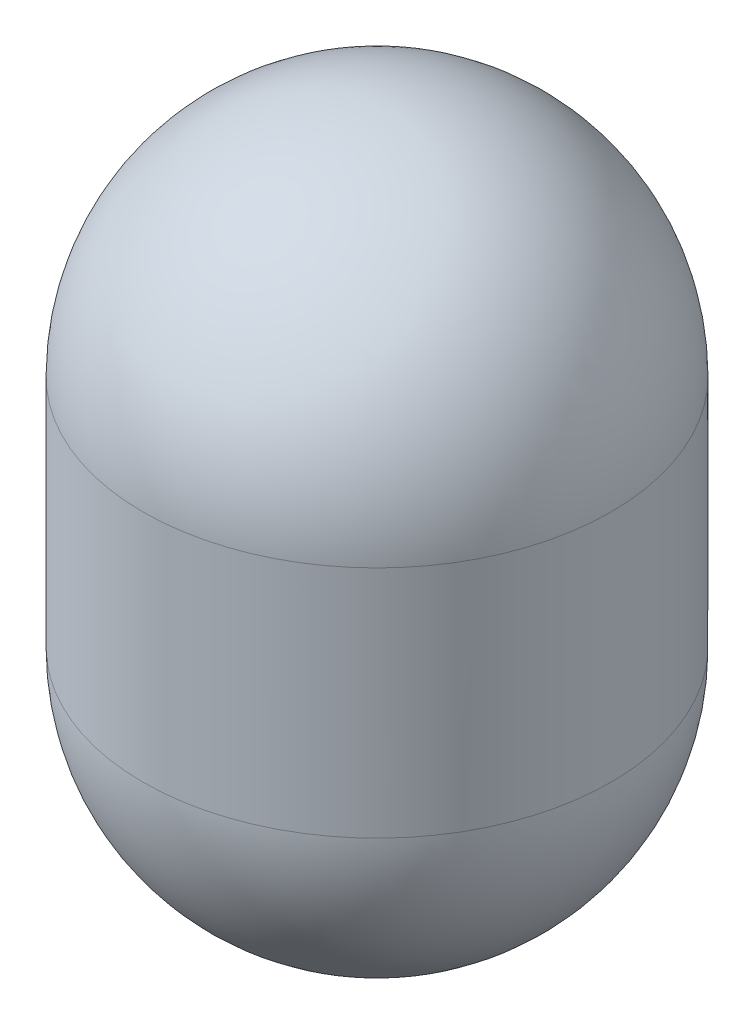
ISO-10303-21;
HEADER;
FILE_DESCRIPTION(('STEP AP214'),'2;1');
FILE_NAME('part.step','',(''),(''),'','','');
FILE_SCHEMA(('AUTOMOTIVE_DESIGN { 1 0 10303 214 1 1 1 1 }'));
ENDSEC;
DATA;
#1=APPLICATION_CONTEXT('core data for automotive mechanical design processes');
#2=APPLICATION_PROTOCOL_DEFINITION('international standard','automotive_design',2000,#1);
#3=PRODUCT_CONTEXT('',#1,'mechanical');
#4=PRODUCT('Part','Part','',(#3));
#5=PRODUCT_RELATED_PRODUCT_CATEGORY('part','',(#4));
#6=PRODUCT_DEFINITION_FORMATION('','',#4);
#7=PRODUCT_DEFINITION_CONTEXT('part definition',#1,'design');
#8=PRODUCT_DEFINITION('design','',#6,#7);
#9=PRODUCT_DEFINITION_SHAPE('','',#8);
#10=(LENGTH_UNIT() NAMED_UNIT(*) SI_UNIT(.MILLI.,.METRE.));
#11=(NAMED_UNIT(*) PLANE_ANGLE_UNIT() SI_UNIT($,.RADIAN.));
#12=(NAMED_UNIT(*) SI_UNIT($,.STERADIAN.) SOLID_ANGLE_UNIT());
#13=UNCERTAINTY_MEASURE_WITH_UNIT(LENGTH_MEASURE(1.E-05),#10,'distance_accuracy_value','');
#14=(GEOMETRIC_REPRESENTATION_CONTEXT(3) GLOBAL_UNCERTAINTY_ASSIGNED_CONTEXT((#13)) GLOBAL_UNIT_ASSIGNED_CONTEXT((#10,
#11,#12)) REPRESENTATION_CONTEXT('',''));
#15=CARTESIAN_POINT('',(0.,0.,0.));
#16=DIRECTION('',(0.,0.,1.));
#17=DIRECTION('',(1.,0.,0.));
#18=AXIS2_PLACEMENT_3D('',#15,#16,#17);
#19=CARTESIAN_POINT('',(0.,0.,0.));
#20=DIRECTION('',(0.,1.,0.));
#21=DIRECTION('',(1.,0.,0.));
#22=AXIS2_PLACEMENT_3D('',#19,#20,#21);
#23=SPHERICAL_SURFACE('',#22,303.);
#24=CARTESIAN_POINT('',(0.,0.,0.));
#25=DIRECTION('',(0.,1.,0.));
#26=DIRECTION('',(0.,0.,1.));
#27=AXIS2_PLACEMENT_3D('',#24,#25,#26);
#28=CIRCLE('',#27,303.);
#29=CARTESIAN_POINT('',(0.,0.,303.));
#30=VERTEX_POINT('',#29);
#31=EDGE_CURVE('E10',#30,#30,#28,.T.);
#32=ORIENTED_EDGE('',*,*,#31,.T.);
#33=EDGE_LOOP('',(#32));
#34=FACE_BOUND('',#33,.T.);
#35=ADVANCED_FACE('F32',(#34),#23,.T.);
#36=CARTESIAN_POINT('',(0.,0.,0.));
#37=DIRECTION('',(0.,1.,0.));
#38=DIRECTION('',(0.,0.,1.));
#39=AXIS2_PLACEMENT_3D('',#36,#37,#38);
#40=CYLINDRICAL_SURFACE('',#39,303.);
#41=CARTESIAN_POINT('',(0.,-303.,0.));
#42=DIRECTION('',(0.,1.,0.));
#43=DIRECTION('',(0.,0.,1.));
#44=AXIS2_PLACEMENT_3D('',#41,#42,#43);
#45=CIRCLE('',#44,303.);
#46=CARTESIAN_POINT('',(0.,-303.,303.));
#47=VERTEX_POINT('',#46);
#48=EDGE_CURVE('E39',#47,#47,#45,.T.);
#49=ORIENTED_EDGE('',*,*,#48,.T.);
#50=EDGE_LOOP('',(#49));
#51=FACE_BOUND('',#50,.T.);
#52=ORIENTED_EDGE('',*,*,#31,.F.);
#53=EDGE_LOOP('',(#52));
#54=FACE_BOUND('',#53,.T.);
#55=ADVANCED_FACE('F73',(#51,#54),#40,.T.);
#56=CARTESIAN_POINT('',(0.,-303.,0.));
#57=DIRECTION('',(0.,1.,0.));
#58=DIRECTION('',(-1.,0.,0.));
#59=AXIS2_PLACEMENT_3D('',#56,#57,#58);
#60=SPHERICAL_SURFACE('',#59,303.);
#61=ORIENTED_EDGE('',*,*,#48,.F.);
#62=EDGE_LOOP('',(#61));
#63=FACE_BOUND('',#62,.T.);
#64=ADVANCED_FACE('F72',(#63),#60,.T.);
#65=CLOSED_SHELL('',(#35,#55,#64));
#66=CARTESIAN_POINT('',(0.,-303.,0.));
#67=DIRECTION('',(0.,1.,0.));
#68=DIRECTION('',(-1.,0.,0.));
#69=AXIS2_PLACEMENT_3D('',#66,#67,#68);
#70=SPHERICAL_SURFACE('',#69,299.);
#71=CARTESIAN_POINT('',(0.,-303.,0.));
#72=DIRECTION('',(0.,1.,0.));
#73=DIRECTION('',(0.,0.,1.));
#74=AXIS2_PLACEMENT_3D('',#71,#72,#73);
#75=CIRCLE('',#74,299.);
#76=CARTESIAN_POINT('',(0.,-303.,299.));
#77=VERTEX_POINT('',#76);
#78=EDGE_CURVE('E43',#77,#77,#75,.T.);
#79=ORIENTED_EDGE('',*,*,#78,.T.);
#80=EDGE_LOOP('',(#79));
#81=FACE_BOUND('',#80,.T.);
#82=ADVANCED_FACE('F63',(#81),#70,.F.);
#83=CARTESIAN_POINT('',(0.,0.,0.));
#84=DIRECTION('',(0.,1.,0.));
#85=DIRECTION('',(0.,0.,1.));
#86=AXIS2_PLACEMENT_3D('',#83,#84,#85);
#87=CYLINDRICAL_SURFACE('',#86,299.);
#88=CARTESIAN_POINT('',(0.,0.,0.));
#89=DIRECTION('',(0.,1.,0.));
#90=DIRECTION('',(0.,0.,1.));
#91=AXIS2_PLACEMENT_3D('',#88,#89,#90);
#92=CIRCLE('',#91,299.);
#93=CARTESIAN_POINT('',(0.,0.,299.));
#94=VERTEX_POINT('',#93);
#95=EDGE_CURVE('E47',#94,#94,#92,.T.);
#96=ORIENTED_EDGE('',*,*,#95,.T.);
#97=EDGE_LOOP('',(#96));
#98=FACE_BOUND('',#97,.T.);
#99=ORIENTED_EDGE('',*,*,#78,.F.);
#100=EDGE_LOOP('',(#99));
#101=FACE_BOUND('',#100,.T.);
#102=ADVANCED_FACE('F53',(#98,#101),#87,.F.);
#103=CARTESIAN_POINT('',(0.,0.,0.));
#104=DIRECTION('',(0.,1.,0.));
#105=DIRECTION('',(-1.,0.,0.));
#106=AXIS2_PLACEMENT_3D('',#103,#104,#105);
#107=SPHERICAL_SURFACE('',#106,299.);
#108=ORIENTED_EDGE('',*,*,#95,.F.);
#109=EDGE_LOOP('',(#108));
#110=FACE_BOUND('',#109,.T.);
#111=ADVANCED_FACE('F56',(#110),#107,.F.);
#112=CLOSED_SHELL('',(#82,#102,#111));
#113=ORIENTED_CLOSED_SHELL('',*,#112,.T.);
#114=BREP_WITH_VOIDS('B2',#65,(#113));
#115=ADVANCED_BREP_SHAPE_REPRESENTATION('',(#18,#114),#14);
#116=SHAPE_DEFINITION_REPRESENTATION(#9,#115);
ENDSEC;
END-ISO-10303-21;
